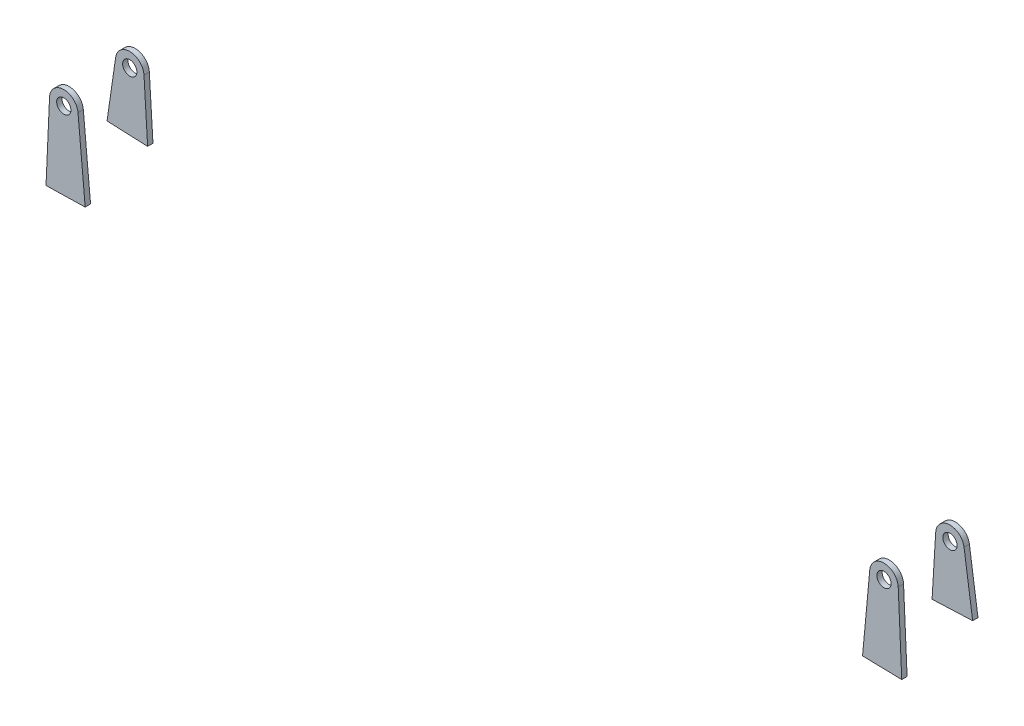
ISO-10303-21;
HEADER;
FILE_DESCRIPTION(('STEP AP214'),'2;1');
FILE_NAME('part.step','',(''),(''),'','','');
FILE_SCHEMA(('AUTOMOTIVE_DESIGN { 1 0 10303 214 1 1 1 1 }'));
ENDSEC;
DATA;
#1=APPLICATION_CONTEXT('core data for automotive mechanical design processes');
#2=APPLICATION_PROTOCOL_DEFINITION('international standard','automotive_design',2000,#1);
#3=PRODUCT_CONTEXT('',#1,'mechanical');
#4=PRODUCT('Part','Part','',(#3));
#5=PRODUCT_RELATED_PRODUCT_CATEGORY('part','',(#4));
#6=PRODUCT_DEFINITION_FORMATION('','',#4);
#7=PRODUCT_DEFINITION_CONTEXT('part definition',#1,'design');
#8=PRODUCT_DEFINITION('design','',#6,#7);
#9=PRODUCT_DEFINITION_SHAPE('','',#8);
#10=(LENGTH_UNIT() NAMED_UNIT(*) SI_UNIT(.MILLI.,.METRE.));
#11=(NAMED_UNIT(*) PLANE_ANGLE_UNIT() SI_UNIT($,.RADIAN.));
#12=(NAMED_UNIT(*) SI_UNIT($,.STERADIAN.) SOLID_ANGLE_UNIT());
#13=UNCERTAINTY_MEASURE_WITH_UNIT(LENGTH_MEASURE(1.E-05),#10,'distance_accuracy_value','');
#14=(GEOMETRIC_REPRESENTATION_CONTEXT(3) GLOBAL_UNCERTAINTY_ASSIGNED_CONTEXT((#13)) GLOBAL_UNIT_ASSIGNED_CONTEXT((#10,
#11,#12)) REPRESENTATION_CONTEXT('',''));
#15=CARTESIAN_POINT('',(0.,0.,0.));
#16=DIRECTION('',(0.,0.,1.));
#17=DIRECTION('',(1.,0.,0.));
#18=AXIS2_PLACEMENT_3D('',#15,#16,#17);
#19=CARTESIAN_POINT('',(0.,-5.87578494066389E-11,2097.99999999999));
#20=DIRECTION('',(0.,0.,1.));
#21=DIRECTION('',(0.,-1.,0.));
#22=AXIS2_PLACEMENT_3D('',#19,#20,#21);
#23=PLANE('',#22);
#24=CARTESIAN_POINT('',(-230.,342.999999999998,2098.));
#25=DIRECTION('',(0.,0.,-1.));
#26=DIRECTION('',(-1.,0.,0.));
#27=AXIS2_PLACEMENT_3D('',#24,#25,#26);
#28=CIRCLE('',#27,3.99999999999999);
#29=CARTESIAN_POINT('',(-234.,342.999999999998,2098.));
#30=VERTEX_POINT('',#29);
#31=EDGE_CURVE('E186',#30,#30,#28,.T.);
#32=ORIENTED_EDGE('',*,*,#31,.T.);
#33=EDGE_LOOP('',(#32));
#34=FACE_BOUND('',#33,.T.);
#35=DIRECTION('',(-0.999130485213242,0.0416926074688509,0.));
#36=VECTOR('',#35,1.);
#37=CARTESIAN_POINT('',(-219.981515577495,309.903736695167,2098.));
#38=LINE('',#37,#36);
#39=CARTESIAN_POINT('',(-219.981515577495,309.903736695167,2098.));
#40=VERTEX_POINT('',#39);
#41=CARTESIAN_POINT('',(-242.740994085605,310.853464501172,2098.));
#42=VERTEX_POINT('',#41);
#43=EDGE_CURVE('E172',#40,#42,#38,.T.);
#44=ORIENTED_EDGE('',*,*,#43,.F.);
#45=DIRECTION('',(0.0604349795585768,-0.998172136079621,0.));
#46=VECTOR('',#45,1.);
#47=CARTESIAN_POINT('',(-222.014622911363,343.483479836467,2098.));
#48=LINE('',#47,#46);
#49=CARTESIAN_POINT('',(-222.014622911363,343.483479836467,2098.));
#50=VERTEX_POINT('',#49);
#51=EDGE_CURVE('E179',#50,#40,#48,.T.);
#52=ORIENTED_EDGE('',*,*,#51,.F.);
#53=CARTESIAN_POINT('',(-230.,342.999999999998,2098.));
#54=DIRECTION('',(0.,0.,-1.));
#55=DIRECTION('',(-1.,0.,0.));
#56=AXIS2_PLACEMENT_3D('',#53,#54,#55);
#57=CIRCLE('',#56,8.00000000000006);
#58=CARTESIAN_POINT('',(-237.917335534063,344.14708240378,2098.));
#59=VERTEX_POINT('',#58);
#60=EDGE_CURVE('E201',#59,#50,#57,.T.);
#61=ORIENTED_EDGE('',*,*,#60,.F.);
#62=DIRECTION('',(0.143385300472698,0.989666941757859,0.));
#63=VECTOR('',#62,1.);
#64=CARTESIAN_POINT('',(-242.740994085605,310.853464501172,2098.));
#65=LINE('',#64,#63);
#66=EDGE_CURVE('E136',#42,#59,#65,.T.);
#67=ORIENTED_EDGE('',*,*,#66,.F.);
#68=EDGE_LOOP('',(#44,#52,#61,#67));
#69=FACE_BOUND('',#68,.T.);
#70=ADVANCED_FACE('F127',(#34,#69),#23,.T.);
#71=CARTESIAN_POINT('',(0.,-5.87578494066389E-11,2094.99999999999));
#72=DIRECTION('',(0.,0.,1.));
#73=DIRECTION('',(0.,-1.,0.));
#74=AXIS2_PLACEMENT_3D('',#71,#72,#73);
#75=PLANE('',#74);
#76=CARTESIAN_POINT('',(-230.,342.999999999998,2095.));
#77=DIRECTION('',(0.,0.,-1.));
#78=DIRECTION('',(-1.,0.,0.));
#79=AXIS2_PLACEMENT_3D('',#76,#77,#78);
#80=CIRCLE('',#79,3.99999999999999);
#81=CARTESIAN_POINT('',(-234.,342.999999999998,2095.));
#82=VERTEX_POINT('',#81);
#83=EDGE_CURVE('E189',#82,#82,#80,.T.);
#84=ORIENTED_EDGE('',*,*,#83,.F.);
#85=EDGE_LOOP('',(#84));
#86=FACE_BOUND('',#85,.T.);
#87=DIRECTION('',(-0.999130485213242,0.0416926074688509,0.));
#88=VECTOR('',#87,1.);
#89=CARTESIAN_POINT('',(-219.981515577495,309.903736695167,2095.));
#90=LINE('',#89,#88);
#91=CARTESIAN_POINT('',(-219.981515577495,309.903736695167,2095.));
#92=VERTEX_POINT('',#91);
#93=CARTESIAN_POINT('',(-242.740994085605,310.853464501172,2095.));
#94=VERTEX_POINT('',#93);
#95=EDGE_CURVE('E174',#92,#94,#90,.T.);
#96=ORIENTED_EDGE('',*,*,#95,.T.);
#97=DIRECTION('',(0.143385300472698,0.989666941757859,0.));
#98=VECTOR('',#97,1.);
#99=CARTESIAN_POINT('',(-242.740994085605,310.853464501172,2095.));
#100=LINE('',#99,#98);
#101=CARTESIAN_POINT('',(-237.917335534063,344.14708240378,2095.));
#102=VERTEX_POINT('',#101);
#103=EDGE_CURVE('E13',#94,#102,#100,.T.);
#104=ORIENTED_EDGE('',*,*,#103,.T.);
#105=CARTESIAN_POINT('',(-230.,342.999999999998,2095.));
#106=DIRECTION('',(0.,0.,-1.));
#107=DIRECTION('',(-1.,0.,0.));
#108=AXIS2_PLACEMENT_3D('',#105,#106,#107);
#109=CIRCLE('',#108,8.00000000000006);
#110=CARTESIAN_POINT('',(-222.014622911363,343.483479836467,2095.));
#111=VERTEX_POINT('',#110);
#112=EDGE_CURVE('E198',#102,#111,#109,.T.);
#113=ORIENTED_EDGE('',*,*,#112,.T.);
#114=DIRECTION('',(0.0604349795585768,-0.998172136079621,0.));
#115=VECTOR('',#114,1.);
#116=CARTESIAN_POINT('',(-222.014622911363,343.483479836467,2095.));
#117=LINE('',#116,#115);
#118=EDGE_CURVE('E203',#111,#92,#117,.T.);
#119=ORIENTED_EDGE('',*,*,#118,.T.);
#120=EDGE_LOOP('',(#96,#104,#113,#119));
#121=FACE_BOUND('',#120,.T.);
#122=ADVANCED_FACE('F215',(#86,#121),#75,.F.);
#123=CARTESIAN_POINT('',(-219.981515577495,309.903736695167,2095.));
#124=DIRECTION('',(-0.0416926074688509,-0.999130485213242,0.));
#125=DIRECTION('',(-0.999130485213242,0.0416926074688509,0.));
#126=AXIS2_PLACEMENT_3D('',#123,#124,#125);
#127=PLANE('',#126);
#128=ORIENTED_EDGE('',*,*,#43,.T.);
#129=DIRECTION('',(0.,0.,1.));
#130=VECTOR('',#129,1.);
#131=CARTESIAN_POINT('',(-242.740994085605,310.853464501172,2095.));
#132=LINE('',#131,#130);
#133=EDGE_CURVE('E162',#94,#42,#132,.T.);
#134=ORIENTED_EDGE('',*,*,#133,.F.);
#135=ORIENTED_EDGE('',*,*,#95,.F.);
#136=DIRECTION('',(0.,0.,1.));
#137=VECTOR('',#136,1.);
#138=CARTESIAN_POINT('',(-219.981515577495,309.903736695167,2095.));
#139=LINE('',#138,#137);
#140=EDGE_CURVE('E168',#92,#40,#139,.T.);
#141=ORIENTED_EDGE('',*,*,#140,.T.);
#142=EDGE_LOOP('',(#128,#134,#135,#141));
#143=FACE_BOUND('',#142,.T.);
#144=ADVANCED_FACE('F170',(#143),#127,.T.);
#145=CARTESIAN_POINT('',(-222.014622911363,343.483479836467,2095.));
#146=DIRECTION('',(0.998172136079622,0.0604349795585768,0.));
#147=DIRECTION('',(0.0604349795585768,-0.998172136079622,0.));
#148=AXIS2_PLACEMENT_3D('',#145,#146,#147);
#149=PLANE('',#148);
#150=ORIENTED_EDGE('',*,*,#51,.T.);
#151=ORIENTED_EDGE('',*,*,#140,.F.);
#152=ORIENTED_EDGE('',*,*,#118,.F.);
#153=DIRECTION('',(0.,0.,1.));
#154=VECTOR('',#153,1.);
#155=CARTESIAN_POINT('',(-222.014622911363,343.483479836467,2095.));
#156=LINE('',#155,#154);
#157=EDGE_CURVE('E181',#111,#50,#156,.T.);
#158=ORIENTED_EDGE('',*,*,#157,.T.);
#159=EDGE_LOOP('',(#150,#151,#152,#158));
#160=FACE_BOUND('',#159,.T.);
#161=ADVANCED_FACE('F180',(#160),#149,.T.);
#162=CARTESIAN_POINT('',(-230.,342.999999999998,2095.));
#163=DIRECTION('',(0.,0.,1.));
#164=DIRECTION('',(-1.,0.,0.));
#165=AXIS2_PLACEMENT_3D('',#162,#163,#164);
#166=CYLINDRICAL_SURFACE('',#165,8.00000000000006);
#167=ORIENTED_EDGE('',*,*,#60,.T.);
#168=ORIENTED_EDGE('',*,*,#157,.F.);
#169=ORIENTED_EDGE('',*,*,#112,.F.);
#170=DIRECTION('',(0.,0.,1.));
#171=VECTOR('',#170,1.);
#172=CARTESIAN_POINT('',(-237.917335534063,344.14708240378,2095.));
#173=LINE('',#172,#171);
#174=EDGE_CURVE('E145',#102,#59,#173,.T.);
#175=ORIENTED_EDGE('',*,*,#174,.T.);
#176=EDGE_LOOP('',(#167,#168,#169,#175));
#177=FACE_BOUND('',#176,.T.);
#178=ADVANCED_FACE('F246',(#177),#166,.T.);
#179=CARTESIAN_POINT('',(-242.740994085605,310.853464501172,2095.));
#180=DIRECTION('',(-0.989666941757859,0.143385300472698,0.));
#181=DIRECTION('',(0.143385300472698,0.98966694175786,0.));
#182=AXIS2_PLACEMENT_3D('',#179,#180,#181);
#183=PLANE('',#182);
#184=ORIENTED_EDGE('',*,*,#66,.T.);
#185=ORIENTED_EDGE('',*,*,#174,.F.);
#186=ORIENTED_EDGE('',*,*,#103,.F.);
#187=ORIENTED_EDGE('',*,*,#133,.T.);
#188=EDGE_LOOP('',(#184,#185,#186,#187));
#189=FACE_BOUND('',#188,.T.);
#190=ADVANCED_FACE('F243',(#189),#183,.T.);
#191=CARTESIAN_POINT('',(-230.,342.999999999998,2095.));
#192=DIRECTION('',(0.,0.,1.));
#193=DIRECTION('',(-1.,0.,0.));
#194=AXIS2_PLACEMENT_3D('',#191,#192,#193);
#195=CYLINDRICAL_SURFACE('',#194,3.99999999999999);
#196=ORIENTED_EDGE('',*,*,#83,.T.);
#197=EDGE_LOOP('',(#196));
#198=FACE_BOUND('',#197,.T.);
#199=ORIENTED_EDGE('',*,*,#31,.F.);
#200=EDGE_LOOP('',(#199));
#201=FACE_BOUND('',#200,.T.);
#202=ADVANCED_FACE('F232',(#198,#201),#195,.F.);
#203=CLOSED_SHELL('',(#70,#122,#144,#161,#178,#190,#202));
#204=MANIFOLD_SOLID_BREP('B2',#203);
#205=CARTESIAN_POINT('',(0.,-1.75515127215923E-11,2135.));
#206=DIRECTION('',(0.,0.,1.));
#207=DIRECTION('',(0.,-1.,0.));
#208=AXIS2_PLACEMENT_3D('',#205,#206,#207);
#209=PLANE('',#208);
#210=CARTESIAN_POINT('',(-230.,342.999999999998,2135.));
#211=DIRECTION('',(0.,0.,-1.));
#212=DIRECTION('',(-1.,0.,0.));
#213=AXIS2_PLACEMENT_3D('',#210,#211,#212);
#214=CIRCLE('',#213,3.99999999999999);
#215=CARTESIAN_POINT('',(-234.,342.999999999998,2135.));
#216=VERTEX_POINT('',#215);
#217=EDGE_CURVE('E364',#216,#216,#214,.T.);
#218=ORIENTED_EDGE('',*,*,#217,.T.);
#219=EDGE_LOOP('',(#218));
#220=FACE_BOUND('',#219,.T.);
#221=DIRECTION('',(-0.999727673920255,-0.023336195019669,0.));
#222=VECTOR('',#221,1.);
#223=CARTESIAN_POINT('',(-217.999104301474,299.910154526586,2135.));
#224=LINE('',#223,#222);
#225=CARTESIAN_POINT('',(-217.999104301474,299.910154526586,2135.));
#226=VERTEX_POINT('',#225);
#227=CARTESIAN_POINT('',(-239.977266452983,299.397128137979,2135.));
#228=VERTEX_POINT('',#227);
#229=EDGE_CURVE('E350',#226,#228,#224,.T.);
#230=ORIENTED_EDGE('',*,*,#229,.F.);
#231=DIRECTION('',(0.0916772200200033,-0.995788776462862,0.));
#232=VECTOR('',#231,1.);
#233=CARTESIAN_POINT('',(-222.033689788297,343.733417760158,2135.));
#234=LINE('',#233,#232);
#235=CARTESIAN_POINT('',(-222.033689788297,343.733417760158,2135.));
#236=VERTEX_POINT('',#235);
#237=EDGE_CURVE('E357',#236,#226,#234,.T.);
#238=ORIENTED_EDGE('',*,*,#237,.F.);
#239=CARTESIAN_POINT('',(-230.,342.999999999998,2135.));
#240=DIRECTION('',(0.,0.,-1.));
#241=DIRECTION('',(-1.,0.,0.));
#242=AXIS2_PLACEMENT_3D('',#239,#240,#241);
#243=CIRCLE('',#242,8.00000000000002);
#244=CARTESIAN_POINT('',(-237.991854695114,343.360913469103,2135.));
#245=VERTEX_POINT('',#244);
#246=EDGE_CURVE('E379',#245,#236,#243,.T.);
#247=ORIENTED_EDGE('',*,*,#246,.F.);
#248=DIRECTION('',(0.0451141836381548,0.998981836889271,0.));
#249=VECTOR('',#248,1.);
#250=CARTESIAN_POINT('',(-239.977266452983,299.397128137979,2135.));
#251=LINE('',#250,#249);
#252=EDGE_CURVE('E314',#228,#245,#251,.T.);
#253=ORIENTED_EDGE('',*,*,#252,.F.);
#254=EDGE_LOOP('',(#230,#238,#247,#253));
#255=FACE_BOUND('',#254,.T.);
#256=ADVANCED_FACE('F305',(#220,#255),#209,.T.);
#257=CARTESIAN_POINT('',(0.,-1.75515127215923E-11,2132.));
#258=DIRECTION('',(0.,0.,1.));
#259=DIRECTION('',(0.,-1.,0.));
#260=AXIS2_PLACEMENT_3D('',#257,#258,#259);
#261=PLANE('',#260);
#262=CARTESIAN_POINT('',(-230.,342.999999999998,2132.));
#263=DIRECTION('',(0.,0.,-1.));
#264=DIRECTION('',(-1.,0.,0.));
#265=AXIS2_PLACEMENT_3D('',#262,#263,#264);
#266=CIRCLE('',#265,3.99999999999999);
#267=CARTESIAN_POINT('',(-234.,342.999999999998,2132.));
#268=VERTEX_POINT('',#267);
#269=EDGE_CURVE('E367',#268,#268,#266,.T.);
#270=ORIENTED_EDGE('',*,*,#269,.F.);
#271=EDGE_LOOP('',(#270));
#272=FACE_BOUND('',#271,.T.);
#273=DIRECTION('',(-0.999727673920255,-0.023336195019669,0.));
#274=VECTOR('',#273,1.);
#275=CARTESIAN_POINT('',(-217.999104301474,299.910154526586,2132.));
#276=LINE('',#275,#274);
#277=CARTESIAN_POINT('',(-217.999104301474,299.910154526586,2132.));
#278=VERTEX_POINT('',#277);
#279=CARTESIAN_POINT('',(-239.977266452983,299.397128137979,2132.));
#280=VERTEX_POINT('',#279);
#281=EDGE_CURVE('E352',#278,#280,#276,.T.);
#282=ORIENTED_EDGE('',*,*,#281,.T.);
#283=DIRECTION('',(0.0451141836381548,0.998981836889271,0.));
#284=VECTOR('',#283,1.);
#285=CARTESIAN_POINT('',(-239.977266452983,299.397128137979,2132.));
#286=LINE('',#285,#284);
#287=CARTESIAN_POINT('',(-237.991854695114,343.360913469103,2132.));
#288=VERTEX_POINT('',#287);
#289=EDGE_CURVE('E125',#280,#288,#286,.T.);
#290=ORIENTED_EDGE('',*,*,#289,.T.);
#291=CARTESIAN_POINT('',(-230.,342.999999999998,2132.));
#292=DIRECTION('',(0.,0.,-1.));
#293=DIRECTION('',(-1.,0.,0.));
#294=AXIS2_PLACEMENT_3D('',#291,#292,#293);
#295=CIRCLE('',#294,8.00000000000002);
#296=CARTESIAN_POINT('',(-222.033689788297,343.733417760158,2132.));
#297=VERTEX_POINT('',#296);
#298=EDGE_CURVE('E376',#288,#297,#295,.T.);
#299=ORIENTED_EDGE('',*,*,#298,.T.);
#300=DIRECTION('',(0.0916772200200033,-0.995788776462862,0.));
#301=VECTOR('',#300,1.);
#302=CARTESIAN_POINT('',(-222.033689788297,343.733417760158,2132.));
#303=LINE('',#302,#301);
#304=EDGE_CURVE('E381',#297,#278,#303,.T.);
#305=ORIENTED_EDGE('',*,*,#304,.T.);
#306=EDGE_LOOP('',(#282,#290,#299,#305));
#307=FACE_BOUND('',#306,.T.);
#308=ADVANCED_FACE('F393',(#272,#307),#261,.F.);
#309=CARTESIAN_POINT('',(-217.999104301474,299.910154526586,2132.));
#310=DIRECTION('',(0.023336195019669,-0.999727673920255,0.));
#311=DIRECTION('',(-0.999727673920255,-0.023336195019669,0.));
#312=AXIS2_PLACEMENT_3D('',#309,#310,#311);
#313=PLANE('',#312);
#314=ORIENTED_EDGE('',*,*,#229,.T.);
#315=DIRECTION('',(0.,0.,1.));
#316=VECTOR('',#315,1.);
#317=CARTESIAN_POINT('',(-239.977266452983,299.397128137979,2132.));
#318=LINE('',#317,#316);
#319=EDGE_CURVE('E340',#280,#228,#318,.T.);
#320=ORIENTED_EDGE('',*,*,#319,.F.);
#321=ORIENTED_EDGE('',*,*,#281,.F.);
#322=DIRECTION('',(0.,0.,1.));
#323=VECTOR('',#322,1.);
#324=CARTESIAN_POINT('',(-217.999104301474,299.910154526586,2132.));
#325=LINE('',#324,#323);
#326=EDGE_CURVE('E346',#278,#226,#325,.T.);
#327=ORIENTED_EDGE('',*,*,#326,.T.);
#328=EDGE_LOOP('',(#314,#320,#321,#327));
#329=FACE_BOUND('',#328,.T.);
#330=ADVANCED_FACE('F348',(#329),#313,.T.);
#331=CARTESIAN_POINT('',(-222.033689788297,343.733417760158,2132.));
#332=DIRECTION('',(0.995788776462862,0.0916772200200033,0.));
#333=DIRECTION('',(0.0916772200200033,-0.995788776462862,0.));
#334=AXIS2_PLACEMENT_3D('',#331,#332,#333);
#335=PLANE('',#334);
#336=ORIENTED_EDGE('',*,*,#237,.T.);
#337=ORIENTED_EDGE('',*,*,#326,.F.);
#338=ORIENTED_EDGE('',*,*,#304,.F.);
#339=DIRECTION('',(0.,0.,1.));
#340=VECTOR('',#339,1.);
#341=CARTESIAN_POINT('',(-222.033689788297,343.733417760158,2132.));
#342=LINE('',#341,#340);
#343=EDGE_CURVE('E359',#297,#236,#342,.T.);
#344=ORIENTED_EDGE('',*,*,#343,.T.);
#345=EDGE_LOOP('',(#336,#337,#338,#344));
#346=FACE_BOUND('',#345,.T.);
#347=ADVANCED_FACE('F358',(#346),#335,.T.);
#348=CARTESIAN_POINT('',(-230.,342.999999999998,2132.));
#349=DIRECTION('',(0.,0.,1.));
#350=DIRECTION('',(-1.,0.,0.));
#351=AXIS2_PLACEMENT_3D('',#348,#349,#350);
#352=CYLINDRICAL_SURFACE('',#351,8.00000000000002);
#353=ORIENTED_EDGE('',*,*,#246,.T.);
#354=ORIENTED_EDGE('',*,*,#343,.F.);
#355=ORIENTED_EDGE('',*,*,#298,.F.);
#356=DIRECTION('',(0.,0.,1.));
#357=VECTOR('',#356,1.);
#358=CARTESIAN_POINT('',(-237.991854695114,343.360913469103,2132.));
#359=LINE('',#358,#357);
#360=EDGE_CURVE('E323',#288,#245,#359,.T.);
#361=ORIENTED_EDGE('',*,*,#360,.T.);
#362=EDGE_LOOP('',(#353,#354,#355,#361));
#363=FACE_BOUND('',#362,.T.);
#364=ADVANCED_FACE('F424',(#363),#352,.T.);
#365=CARTESIAN_POINT('',(-239.977266452983,299.397128137979,2132.));
#366=DIRECTION('',(-0.998981836889271,0.0451141836381548,0.));
#367=DIRECTION('',(0.0451141836381548,0.998981836889271,0.));
#368=AXIS2_PLACEMENT_3D('',#365,#366,#367);
#369=PLANE('',#368);
#370=ORIENTED_EDGE('',*,*,#252,.T.);
#371=ORIENTED_EDGE('',*,*,#360,.F.);
#372=ORIENTED_EDGE('',*,*,#289,.F.);
#373=ORIENTED_EDGE('',*,*,#319,.T.);
#374=EDGE_LOOP('',(#370,#371,#372,#373));
#375=FACE_BOUND('',#374,.T.);
#376=ADVANCED_FACE('F421',(#375),#369,.T.);
#377=CARTESIAN_POINT('',(-230.,342.999999999998,2132.));
#378=DIRECTION('',(0.,0.,1.));
#379=DIRECTION('',(-1.,0.,0.));
#380=AXIS2_PLACEMENT_3D('',#377,#378,#379);
#381=CYLINDRICAL_SURFACE('',#380,3.99999999999999);
#382=ORIENTED_EDGE('',*,*,#269,.T.);
#383=EDGE_LOOP('',(#382));
#384=FACE_BOUND('',#383,.T.);
#385=ORIENTED_EDGE('',*,*,#217,.F.);
#386=EDGE_LOOP('',(#385));
#387=FACE_BOUND('',#386,.T.);
#388=ADVANCED_FACE('F410',(#384,#387),#381,.F.);
#389=CLOSED_SHELL('',(#256,#308,#330,#347,#364,#376,#388));
#390=MANIFOLD_SOLID_BREP('B7',#389);
#391=CARTESIAN_POINT('',(0.,-5.87578494066389E-11,2097.99999999999));
#392=DIRECTION('',(0.,0.,1.));
#393=DIRECTION('',(0.,-1.,0.));
#394=AXIS2_PLACEMENT_3D('',#391,#392,#393);
#395=PLANE('',#394);
#396=CARTESIAN_POINT('',(230.,342.999999999998,2098.));
#397=DIRECTION('',(0.,0.,1.));
#398=DIRECTION('',(1.,0.,0.));
#399=AXIS2_PLACEMENT_3D('',#396,#397,#398);
#400=CIRCLE('',#399,3.99999999999999);
#401=CARTESIAN_POINT('',(234.,342.999999999998,2098.));
#402=VERTEX_POINT('',#401);
#403=EDGE_CURVE('E543',#402,#402,#400,.T.);
#404=ORIENTED_EDGE('',*,*,#403,.F.);
#405=EDGE_LOOP('',(#404));
#406=FACE_BOUND('',#405,.T.);
#407=DIRECTION('',(0.999130485213242,0.0416926074688509,0.));
#408=VECTOR('',#407,1.);
#409=CARTESIAN_POINT('',(219.981515577495,309.903736695167,2098.));
#410=LINE('',#409,#408);
#411=CARTESIAN_POINT('',(219.981515577495,309.903736695167,2098.));
#412=VERTEX_POINT('',#411);
#413=CARTESIAN_POINT('',(242.740994085605,310.853464501172,2098.));
#414=VERTEX_POINT('',#413);
#415=EDGE_CURVE('E519',#412,#414,#410,.T.);
#416=ORIENTED_EDGE('',*,*,#415,.T.);
#417=DIRECTION('',(-0.143385300472698,0.989666941757859,0.));
#418=VECTOR('',#417,1.);
#419=CARTESIAN_POINT('',(242.740994085605,310.853464501172,2098.));
#420=LINE('',#419,#418);
#421=CARTESIAN_POINT('',(237.917335534063,344.14708240378,2098.));
#422=VERTEX_POINT('',#421);
#423=EDGE_CURVE('E491',#414,#422,#420,.T.);
#424=ORIENTED_EDGE('',*,*,#423,.T.);
#425=CARTESIAN_POINT('',(230.,342.999999999998,2098.));
#426=DIRECTION('',(0.,0.,1.));
#427=DIRECTION('',(1.,0.,0.));
#428=AXIS2_PLACEMENT_3D('',#425,#426,#427);
#429=CIRCLE('',#428,8.00000000000006);
#430=CARTESIAN_POINT('',(222.014622911363,343.483479836467,2098.));
#431=VERTEX_POINT('',#430);
#432=EDGE_CURVE('E525',#422,#431,#429,.T.);
#433=ORIENTED_EDGE('',*,*,#432,.T.);
#434=DIRECTION('',(-0.0604349795585768,-0.998172136079621,0.));
#435=VECTOR('',#434,1.);
#436=CARTESIAN_POINT('',(222.014622911363,343.483479836467,2098.));
#437=LINE('',#436,#435);
#438=EDGE_CURVE('E522',#431,#412,#437,.T.);
#439=ORIENTED_EDGE('',*,*,#438,.T.);
#440=EDGE_LOOP('',(#416,#424,#433,#439));
#441=FACE_BOUND('',#440,.T.);
#442=ADVANCED_FACE('F482',(#406,#441),#395,.T.);
#443=CARTESIAN_POINT('',(0.,-5.87578494066389E-11,2094.99999999999));
#444=DIRECTION('',(0.,0.,1.));
#445=DIRECTION('',(0.,-1.,0.));
#446=AXIS2_PLACEMENT_3D('',#443,#444,#445);
#447=PLANE('',#446);
#448=CARTESIAN_POINT('',(230.,342.999999999998,2095.));
#449=DIRECTION('',(0.,0.,1.));
#450=DIRECTION('',(1.,0.,0.));
#451=AXIS2_PLACEMENT_3D('',#448,#449,#450);
#452=CIRCLE('',#451,3.99999999999999);
#453=CARTESIAN_POINT('',(234.,342.999999999998,2095.));
#454=VERTEX_POINT('',#453);
#455=EDGE_CURVE('E546',#454,#454,#452,.T.);
#456=ORIENTED_EDGE('',*,*,#455,.T.);
#457=EDGE_LOOP('',(#456));
#458=FACE_BOUND('',#457,.T.);
#459=DIRECTION('',(0.999130485213242,0.0416926074688509,0.));
#460=VECTOR('',#459,1.);
#461=CARTESIAN_POINT('',(219.981515577495,309.903736695167,2095.));
#462=LINE('',#461,#460);
#463=CARTESIAN_POINT('',(219.981515577495,309.903736695167,2095.));
#464=VERTEX_POINT('',#463);
#465=CARTESIAN_POINT('',(242.740994085605,310.853464501172,2095.));
#466=VERTEX_POINT('',#465);
#467=EDGE_CURVE('E539',#464,#466,#462,.T.);
#468=ORIENTED_EDGE('',*,*,#467,.F.);
#469=DIRECTION('',(-0.0604349795585768,-0.998172136079621,0.));
#470=VECTOR('',#469,1.);
#471=CARTESIAN_POINT('',(222.014622911363,343.483479836467,2095.));
#472=LINE('',#471,#470);
#473=CARTESIAN_POINT('',(222.014622911363,343.483479836467,2095.));
#474=VERTEX_POINT('',#473);
#475=EDGE_CURVE('E536',#474,#464,#472,.T.);
#476=ORIENTED_EDGE('',*,*,#475,.F.);
#477=CARTESIAN_POINT('',(230.,342.999999999998,2095.));
#478=DIRECTION('',(0.,0.,1.));
#479=DIRECTION('',(1.,0.,0.));
#480=AXIS2_PLACEMENT_3D('',#477,#478,#479);
#481=CIRCLE('',#480,8.00000000000006);
#482=CARTESIAN_POINT('',(237.917335534063,344.14708240378,2095.));
#483=VERTEX_POINT('',#482);
#484=EDGE_CURVE('E500',#483,#474,#481,.T.);
#485=ORIENTED_EDGE('',*,*,#484,.F.);
#486=DIRECTION('',(-0.143385300472698,0.989666941757859,0.));
#487=VECTOR('',#486,1.);
#488=CARTESIAN_POINT('',(242.740994085605,310.853464501172,2095.));
#489=LINE('',#488,#487);
#490=EDGE_CURVE('E303',#466,#483,#489,.T.);
#491=ORIENTED_EDGE('',*,*,#490,.F.);
#492=EDGE_LOOP('',(#468,#476,#485,#491));
#493=FACE_BOUND('',#492,.T.);
#494=ADVANCED_FACE('F586',(#458,#493),#447,.F.);
#495=CARTESIAN_POINT('',(219.981515577495,309.903736695167,2095.));
#496=DIRECTION('',(0.0416926074688509,-0.999130485213242,0.));
#497=DIRECTION('',(0.999130485213242,0.0416926074688509,0.));
#498=AXIS2_PLACEMENT_3D('',#495,#496,#497);
#499=PLANE('',#498);
#500=ORIENTED_EDGE('',*,*,#415,.F.);
#501=DIRECTION('',(0.,0.,1.));
#502=VECTOR('',#501,1.);
#503=CARTESIAN_POINT('',(219.981515577495,309.903736695167,2095.));
#504=LINE('',#503,#502);
#505=EDGE_CURVE('E534',#464,#412,#504,.T.);
#506=ORIENTED_EDGE('',*,*,#505,.F.);
#507=ORIENTED_EDGE('',*,*,#467,.T.);
#508=DIRECTION('',(0.,0.,1.));
#509=VECTOR('',#508,1.);
#510=CARTESIAN_POINT('',(242.740994085605,310.853464501172,2095.));
#511=LINE('',#510,#509);
#512=EDGE_CURVE('E530',#466,#414,#511,.T.);
#513=ORIENTED_EDGE('',*,*,#512,.T.);
#514=EDGE_LOOP('',(#500,#506,#507,#513));
#515=FACE_BOUND('',#514,.T.);
#516=ADVANCED_FACE('F540',(#515),#499,.T.);
#517=CARTESIAN_POINT('',(222.014622911363,343.483479836467,2095.));
#518=DIRECTION('',(-0.998172136079622,0.0604349795585768,0.));
#519=DIRECTION('',(-0.0604349795585768,-0.998172136079622,0.));
#520=AXIS2_PLACEMENT_3D('',#517,#518,#519);
#521=PLANE('',#520);
#522=ORIENTED_EDGE('',*,*,#438,.F.);
#523=DIRECTION('',(0.,0.,1.));
#524=VECTOR('',#523,1.);
#525=CARTESIAN_POINT('',(222.014622911363,343.483479836467,2095.));
#526=LINE('',#525,#524);
#527=EDGE_CURVE('E529',#474,#431,#526,.T.);
#528=ORIENTED_EDGE('',*,*,#527,.F.);
#529=ORIENTED_EDGE('',*,*,#475,.T.);
#530=ORIENTED_EDGE('',*,*,#505,.T.);
#531=EDGE_LOOP('',(#522,#528,#529,#530));
#532=FACE_BOUND('',#531,.T.);
#533=ADVANCED_FACE('F535',(#532),#521,.T.);
#534=CARTESIAN_POINT('',(230.,342.999999999998,2095.));
#535=DIRECTION('',(0.,0.,1.));
#536=DIRECTION('',(1.,0.,0.));
#537=AXIS2_PLACEMENT_3D('',#534,#535,#536);
#538=CYLINDRICAL_SURFACE('',#537,8.00000000000006);
#539=ORIENTED_EDGE('',*,*,#432,.F.);
#540=DIRECTION('',(0.,0.,1.));
#541=VECTOR('',#540,1.);
#542=CARTESIAN_POINT('',(237.917335534063,344.14708240378,2095.));
#543=LINE('',#542,#541);
#544=EDGE_CURVE('E558',#483,#422,#543,.T.);
#545=ORIENTED_EDGE('',*,*,#544,.F.);
#546=ORIENTED_EDGE('',*,*,#484,.T.);
#547=ORIENTED_EDGE('',*,*,#527,.T.);
#548=EDGE_LOOP('',(#539,#545,#546,#547));
#549=FACE_BOUND('',#548,.T.);
#550=ADVANCED_FACE('F569',(#549),#538,.T.);
#551=CARTESIAN_POINT('',(242.740994085605,310.853464501172,2095.));
#552=DIRECTION('',(0.989666941757859,0.143385300472698,0.));
#553=DIRECTION('',(-0.143385300472698,0.98966694175786,0.));
#554=AXIS2_PLACEMENT_3D('',#551,#552,#553);
#555=PLANE('',#554);
#556=ORIENTED_EDGE('',*,*,#423,.F.);
#557=ORIENTED_EDGE('',*,*,#512,.F.);
#558=ORIENTED_EDGE('',*,*,#490,.T.);
#559=ORIENTED_EDGE('',*,*,#544,.T.);
#560=EDGE_LOOP('',(#556,#557,#558,#559));
#561=FACE_BOUND('',#560,.T.);
#562=ADVANCED_FACE('F591',(#561),#555,.T.);
#563=CARTESIAN_POINT('',(230.,342.999999999998,2095.));
#564=DIRECTION('',(0.,0.,1.));
#565=DIRECTION('',(1.,0.,0.));
#566=AXIS2_PLACEMENT_3D('',#563,#564,#565);
#567=CYLINDRICAL_SURFACE('',#566,3.99999999999999);
#568=ORIENTED_EDGE('',*,*,#455,.F.);
#569=EDGE_LOOP('',(#568));
#570=FACE_BOUND('',#569,.T.);
#571=ORIENTED_EDGE('',*,*,#403,.T.);
#572=EDGE_LOOP('',(#571));
#573=FACE_BOUND('',#572,.T.);
#574=ADVANCED_FACE('F588',(#570,#573),#567,.F.);
#575=CLOSED_SHELL('',(#442,#494,#516,#533,#550,#562,#574));
#576=MANIFOLD_SOLID_BREP('B119',#575);
#577=CARTESIAN_POINT('',(0.,-1.75515127215923E-11,2135.));
#578=DIRECTION('',(0.,0.,1.));
#579=DIRECTION('',(0.,-1.,0.));
#580=AXIS2_PLACEMENT_3D('',#577,#578,#579);
#581=PLANE('',#580);
#582=CARTESIAN_POINT('',(230.,342.999999999998,2135.));
#583=DIRECTION('',(0.,0.,1.));
#584=DIRECTION('',(1.,0.,0.));
#585=AXIS2_PLACEMENT_3D('',#582,#583,#584);
#586=CIRCLE('',#585,3.99999999999999);
#587=CARTESIAN_POINT('',(234.,342.999999999998,2135.));
#588=VERTEX_POINT('',#587);
#589=EDGE_CURVE('E711',#588,#588,#586,.T.);
#590=ORIENTED_EDGE('',*,*,#589,.F.);
#591=EDGE_LOOP('',(#590));
#592=FACE_BOUND('',#591,.T.);
#593=DIRECTION('',(0.999727673920255,-0.023336195019669,0.));
#594=VECTOR('',#593,1.);
#595=CARTESIAN_POINT('',(217.999104301474,299.910154526586,2135.));
#596=LINE('',#595,#594);
#597=CARTESIAN_POINT('',(217.999104301474,299.910154526586,2135.));
#598=VERTEX_POINT('',#597);
#599=CARTESIAN_POINT('',(239.977266452983,299.397128137979,2135.));
#600=VERTEX_POINT('',#599);
#601=EDGE_CURVE('E687',#598,#600,#596,.T.);
#602=ORIENTED_EDGE('',*,*,#601,.T.);
#603=DIRECTION('',(-0.0451141836381548,0.998981836889271,0.));
#604=VECTOR('',#603,1.);
#605=CARTESIAN_POINT('',(239.977266452983,299.397128137979,2135.));
#606=LINE('',#605,#604);
#607=CARTESIAN_POINT('',(237.991854695114,343.360913469103,2135.));
#608=VERTEX_POINT('',#607);
#609=EDGE_CURVE('E659',#600,#608,#606,.T.);
#610=ORIENTED_EDGE('',*,*,#609,.T.);
#611=CARTESIAN_POINT('',(230.,342.999999999998,2135.));
#612=DIRECTION('',(0.,0.,1.));
#613=DIRECTION('',(1.,0.,0.));
#614=AXIS2_PLACEMENT_3D('',#611,#612,#613);
#615=CIRCLE('',#614,8.00000000000002);
#616=CARTESIAN_POINT('',(222.033689788297,343.733417760158,2135.));
#617=VERTEX_POINT('',#616);
#618=EDGE_CURVE('E693',#608,#617,#615,.T.);
#619=ORIENTED_EDGE('',*,*,#618,.T.);
#620=DIRECTION('',(-0.0916772200200033,-0.995788776462862,0.));
#621=VECTOR('',#620,1.);
#622=CARTESIAN_POINT('',(222.033689788297,343.733417760158,2135.));
#623=LINE('',#622,#621);
#624=EDGE_CURVE('E690',#617,#598,#623,.T.);
#625=ORIENTED_EDGE('',*,*,#624,.T.);
#626=EDGE_LOOP('',(#602,#610,#619,#625));
#627=FACE_BOUND('',#626,.T.);
#628=ADVANCED_FACE('F650',(#592,#627),#581,.T.);
#629=CARTESIAN_POINT('',(0.,-1.75515127215923E-11,2132.));
#630=DIRECTION('',(0.,0.,1.));
#631=DIRECTION('',(0.,-1.,0.));
#632=AXIS2_PLACEMENT_3D('',#629,#630,#631);
#633=PLANE('',#632);
#634=CARTESIAN_POINT('',(230.,342.999999999998,2132.));
#635=DIRECTION('',(0.,0.,1.));
#636=DIRECTION('',(1.,0.,0.));
#637=AXIS2_PLACEMENT_3D('',#634,#635,#636);
#638=CIRCLE('',#637,3.99999999999999);
#639=CARTESIAN_POINT('',(234.,342.999999999998,2132.));
#640=VERTEX_POINT('',#639);
#641=EDGE_CURVE('E714',#640,#640,#638,.T.);
#642=ORIENTED_EDGE('',*,*,#641,.T.);
#643=EDGE_LOOP('',(#642));
#644=FACE_BOUND('',#643,.T.);
#645=DIRECTION('',(0.999727673920255,-0.023336195019669,0.));
#646=VECTOR('',#645,1.);
#647=CARTESIAN_POINT('',(217.999104301474,299.910154526586,2132.));
#648=LINE('',#647,#646);
#649=CARTESIAN_POINT('',(217.999104301474,299.910154526586,2132.));
#650=VERTEX_POINT('',#649);
#651=CARTESIAN_POINT('',(239.977266452983,299.397128137979,2132.));
#652=VERTEX_POINT('',#651);
#653=EDGE_CURVE('E707',#650,#652,#648,.T.);
#654=ORIENTED_EDGE('',*,*,#653,.F.);
#655=DIRECTION('',(-0.0916772200200033,-0.995788776462862,0.));
#656=VECTOR('',#655,1.);
#657=CARTESIAN_POINT('',(222.033689788297,343.733417760158,2132.));
#658=LINE('',#657,#656);
#659=CARTESIAN_POINT('',(222.033689788297,343.733417760158,2132.));
#660=VERTEX_POINT('',#659);
#661=EDGE_CURVE('E704',#660,#650,#658,.T.);
#662=ORIENTED_EDGE('',*,*,#661,.F.);
#663=CARTESIAN_POINT('',(230.,342.999999999998,2132.));
#664=DIRECTION('',(0.,0.,1.));
#665=DIRECTION('',(1.,0.,0.));
#666=AXIS2_PLACEMENT_3D('',#663,#664,#665);
#667=CIRCLE('',#666,8.00000000000002);
#668=CARTESIAN_POINT('',(237.991854695114,343.360913469103,2132.));
#669=VERTEX_POINT('',#668);
#670=EDGE_CURVE('E668',#669,#660,#667,.T.);
#671=ORIENTED_EDGE('',*,*,#670,.F.);
#672=DIRECTION('',(-0.0451141836381548,0.998981836889271,0.));
#673=VECTOR('',#672,1.);
#674=CARTESIAN_POINT('',(239.977266452983,299.397128137979,2132.));
#675=LINE('',#674,#673);
#676=EDGE_CURVE('E480',#652,#669,#675,.T.);
#677=ORIENTED_EDGE('',*,*,#676,.F.);
#678=EDGE_LOOP('',(#654,#662,#671,#677));
#679=FACE_BOUND('',#678,.T.);
#680=ADVANCED_FACE('F754',(#644,#679),#633,.F.);
#681=CARTESIAN_POINT('',(217.999104301474,299.910154526586,2132.));
#682=DIRECTION('',(-0.023336195019669,-0.999727673920255,0.));
#683=DIRECTION('',(0.999727673920255,-0.023336195019669,0.));
#684=AXIS2_PLACEMENT_3D('',#681,#682,#683);
#685=PLANE('',#684);
#686=ORIENTED_EDGE('',*,*,#601,.F.);
#687=DIRECTION('',(0.,0.,1.));
#688=VECTOR('',#687,1.);
#689=CARTESIAN_POINT('',(217.999104301474,299.910154526586,2132.));
#690=LINE('',#689,#688);
#691=EDGE_CURVE('E702',#650,#598,#690,.T.);
#692=ORIENTED_EDGE('',*,*,#691,.F.);
#693=ORIENTED_EDGE('',*,*,#653,.T.);
#694=DIRECTION('',(0.,0.,1.));
#695=VECTOR('',#694,1.);
#696=CARTESIAN_POINT('',(239.977266452983,299.397128137979,2132.));
#697=LINE('',#696,#695);
#698=EDGE_CURVE('E698',#652,#600,#697,.T.);
#699=ORIENTED_EDGE('',*,*,#698,.T.);
#700=EDGE_LOOP('',(#686,#692,#693,#699));
#701=FACE_BOUND('',#700,.T.);
#702=ADVANCED_FACE('F708',(#701),#685,.T.);
#703=CARTESIAN_POINT('',(222.033689788297,343.733417760158,2132.));
#704=DIRECTION('',(-0.995788776462862,0.0916772200200033,0.));
#705=DIRECTION('',(-0.0916772200200033,-0.995788776462862,0.));
#706=AXIS2_PLACEMENT_3D('',#703,#704,#705);
#707=PLANE('',#706);
#708=ORIENTED_EDGE('',*,*,#624,.F.);
#709=DIRECTION('',(0.,0.,1.));
#710=VECTOR('',#709,1.);
#711=CARTESIAN_POINT('',(222.033689788297,343.733417760158,2132.));
#712=LINE('',#711,#710);
#713=EDGE_CURVE('E697',#660,#617,#712,.T.);
#714=ORIENTED_EDGE('',*,*,#713,.F.);
#715=ORIENTED_EDGE('',*,*,#661,.T.);
#716=ORIENTED_EDGE('',*,*,#691,.T.);
#717=EDGE_LOOP('',(#708,#714,#715,#716));
#718=FACE_BOUND('',#717,.T.);
#719=ADVANCED_FACE('F703',(#718),#707,.T.);
#720=CARTESIAN_POINT('',(230.,342.999999999998,2132.));
#721=DIRECTION('',(0.,0.,1.));
#722=DIRECTION('',(1.,0.,0.));
#723=AXIS2_PLACEMENT_3D('',#720,#721,#722);
#724=CYLINDRICAL_SURFACE('',#723,8.00000000000002);
#725=ORIENTED_EDGE('',*,*,#618,.F.);
#726=DIRECTION('',(0.,0.,1.));
#727=VECTOR('',#726,1.);
#728=CARTESIAN_POINT('',(237.991854695114,343.360913469103,2132.));
#729=LINE('',#728,#727);
#730=EDGE_CURVE('E726',#669,#608,#729,.T.);
#731=ORIENTED_EDGE('',*,*,#730,.F.);
#732=ORIENTED_EDGE('',*,*,#670,.T.);
#733=ORIENTED_EDGE('',*,*,#713,.T.);
#734=EDGE_LOOP('',(#725,#731,#732,#733));
#735=FACE_BOUND('',#734,.T.);
#736=ADVANCED_FACE('F737',(#735),#724,.T.);
#737=CARTESIAN_POINT('',(239.977266452983,299.397128137979,2132.));
#738=DIRECTION('',(0.998981836889271,0.0451141836381548,0.));
#739=DIRECTION('',(-0.0451141836381548,0.998981836889271,0.));
#740=AXIS2_PLACEMENT_3D('',#737,#738,#739);
#741=PLANE('',#740);
#742=ORIENTED_EDGE('',*,*,#609,.F.);
#743=ORIENTED_EDGE('',*,*,#698,.F.);
#744=ORIENTED_EDGE('',*,*,#676,.T.);
#745=ORIENTED_EDGE('',*,*,#730,.T.);
#746=EDGE_LOOP('',(#742,#743,#744,#745));
#747=FACE_BOUND('',#746,.T.);
#748=ADVANCED_FACE('F759',(#747),#741,.T.);
#749=CARTESIAN_POINT('',(230.,342.999999999998,2132.));
#750=DIRECTION('',(0.,0.,1.));
#751=DIRECTION('',(1.,0.,0.));
#752=AXIS2_PLACEMENT_3D('',#749,#750,#751);
#753=CYLINDRICAL_SURFACE('',#752,3.99999999999999);
#754=ORIENTED_EDGE('',*,*,#641,.F.);
#755=EDGE_LOOP('',(#754));
#756=FACE_BOUND('',#755,.T.);
#757=ORIENTED_EDGE('',*,*,#589,.T.);
#758=EDGE_LOOP('',(#757));
#759=FACE_BOUND('',#758,.T.);
#760=ADVANCED_FACE('F756',(#756,#759),#753,.F.);
#761=CLOSED_SHELL('',(#628,#680,#702,#719,#736,#748,#760));
#762=MANIFOLD_SOLID_BREP('B297',#761);
#763=ADVANCED_BREP_SHAPE_REPRESENTATION('',(#18,#204,#390,#576,#762),#14);
#764=SHAPE_DEFINITION_REPRESENTATION(#9,#763);
ENDSEC;
END-ISO-10303-21;
